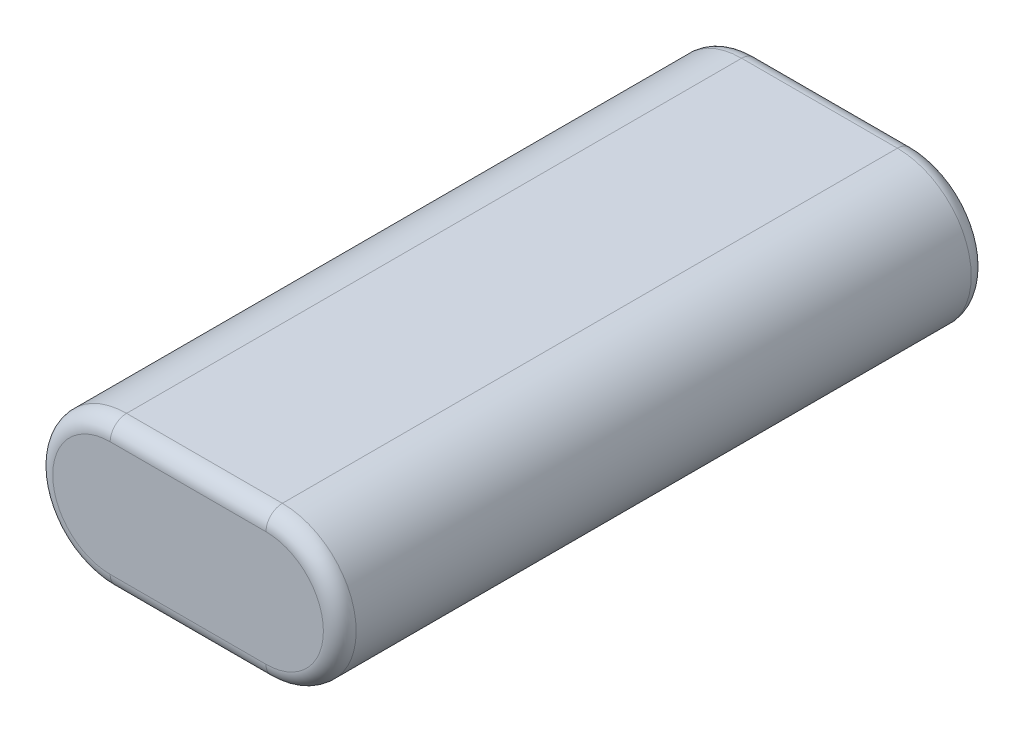
ISO-10303-21;
HEADER;
FILE_DESCRIPTION(('STEP AP214'),'2;1');
FILE_NAME('part.step','',(''),(''),'','','');
FILE_SCHEMA(('AUTOMOTIVE_DESIGN { 1 0 10303 214 1 1 1 1 }'));
ENDSEC;
DATA;
#1=APPLICATION_CONTEXT('core data for automotive mechanical design processes');
#2=APPLICATION_PROTOCOL_DEFINITION('international standard','automotive_design',2000,#1);
#3=PRODUCT_CONTEXT('',#1,'mechanical');
#4=PRODUCT('Part','Part','',(#3));
#5=PRODUCT_RELATED_PRODUCT_CATEGORY('part','',(#4));
#6=PRODUCT_DEFINITION_FORMATION('','',#4);
#7=PRODUCT_DEFINITION_CONTEXT('part definition',#1,'design');
#8=PRODUCT_DEFINITION('design','',#6,#7);
#9=PRODUCT_DEFINITION_SHAPE('','',#8);
#10=(LENGTH_UNIT() NAMED_UNIT(*) SI_UNIT(.MILLI.,.METRE.));
#11=(NAMED_UNIT(*) PLANE_ANGLE_UNIT() SI_UNIT($,.RADIAN.));
#12=(NAMED_UNIT(*) SI_UNIT($,.STERADIAN.) SOLID_ANGLE_UNIT());
#13=UNCERTAINTY_MEASURE_WITH_UNIT(LENGTH_MEASURE(1.E-05),#10,'distance_accuracy_value','');
#14=(GEOMETRIC_REPRESENTATION_CONTEXT(3) GLOBAL_UNCERTAINTY_ASSIGNED_CONTEXT((#13)) GLOBAL_UNIT_ASSIGNED_CONTEXT((#10,
#11,#12)) REPRESENTATION_CONTEXT('',''));
#15=CARTESIAN_POINT('',(0.,0.,0.));
#16=DIRECTION('',(0.,0.,1.));
#17=DIRECTION('',(1.,0.,0.));
#18=AXIS2_PLACEMENT_3D('',#15,#16,#17);
#19=CARTESIAN_POINT('',(0.,-9.,79.));
#20=DIRECTION('',(0.,1.,0.));
#21=DIRECTION('',(0.,0.,1.));
#22=AXIS2_PLACEMENT_3D('',#19,#20,#21);
#23=PLANE('',#22);
#24=DIRECTION('',(0.,0.,-1.));
#25=VECTOR('',#24,1.);
#26=CARTESIAN_POINT('',(0.,-9.,79.));
#27=LINE('',#26,#25);
#28=CARTESIAN_POINT('',(0.,-9.,77.));
#29=VERTEX_POINT('',#28);
#30=CARTESIAN_POINT('',(0.,-9.,2.));
#31=VERTEX_POINT('',#30);
#32=EDGE_CURVE('E123',#29,#31,#27,.T.);
#33=ORIENTED_EDGE('',*,*,#32,.T.);
#34=DIRECTION('',(1.,0.,0.));
#35=VECTOR('',#34,1.);
#36=CARTESIAN_POINT('',(0.,-9.,2.));
#37=LINE('',#36,#35);
#38=CARTESIAN_POINT('',(19.,-9.,2.));
#39=VERTEX_POINT('',#38);
#40=EDGE_CURVE('E125',#31,#39,#37,.T.);
#41=ORIENTED_EDGE('',*,*,#40,.T.);
#42=DIRECTION('',(0.,0.,-1.));
#43=VECTOR('',#42,1.);
#44=CARTESIAN_POINT('',(19.,-9.,79.));
#45=LINE('',#44,#43);
#46=CARTESIAN_POINT('',(19.,-9.,77.));
#47=VERTEX_POINT('',#46);
#48=EDGE_CURVE('E118',#47,#39,#45,.T.);
#49=ORIENTED_EDGE('',*,*,#48,.F.);
#50=DIRECTION('',(1.,0.,0.));
#51=VECTOR('',#50,1.);
#52=CARTESIAN_POINT('',(0.,-9.,77.));
#53=LINE('',#52,#51);
#54=EDGE_CURVE('E104',#47,#29,#53,.F.);
#55=ORIENTED_EDGE('',*,*,#54,.T.);
#56=EDGE_LOOP('',(#33,#41,#49,#55));
#57=FACE_BOUND('',#56,.T.);
#58=ADVANCED_FACE('F35',(#57),#23,.F.);
#59=CARTESIAN_POINT('',(19.,0.,79.));
#60=DIRECTION('',(0.,0.,-1.));
#61=DIRECTION('',(-1.,0.,0.));
#62=AXIS2_PLACEMENT_3D('',#59,#60,#61);
#63=CYLINDRICAL_SURFACE('',#62,9.);
#64=ORIENTED_EDGE('',*,*,#48,.T.);
#65=CARTESIAN_POINT('',(19.,0.,2.));
#66=DIRECTION('',(0.,0.,1.));
#67=DIRECTION('',(1.,0.,0.));
#68=AXIS2_PLACEMENT_3D('',#65,#66,#67);
#69=CIRCLE('',#68,9.);
#70=CARTESIAN_POINT('',(19.,9.,2.));
#71=VERTEX_POINT('',#70);
#72=EDGE_CURVE('E155',#39,#71,#69,.T.);
#73=ORIENTED_EDGE('',*,*,#72,.T.);
#74=DIRECTION('',(0.,0.,-1.));
#75=VECTOR('',#74,1.);
#76=CARTESIAN_POINT('',(19.,9.,79.));
#77=LINE('',#76,#75);
#78=CARTESIAN_POINT('',(19.,9.,77.));
#79=VERTEX_POINT('',#78);
#80=EDGE_CURVE('E134',#79,#71,#77,.T.);
#81=ORIENTED_EDGE('',*,*,#80,.F.);
#82=CARTESIAN_POINT('',(19.,0.,77.));
#83=DIRECTION('',(0.,0.,1.));
#84=DIRECTION('',(1.,0.,0.));
#85=AXIS2_PLACEMENT_3D('',#82,#83,#84);
#86=CIRCLE('',#85,9.);
#87=EDGE_CURVE('E153',#79,#47,#86,.F.);
#88=ORIENTED_EDGE('',*,*,#87,.T.);
#89=EDGE_LOOP('',(#64,#73,#81,#88));
#90=FACE_BOUND('',#89,.T.);
#91=ADVANCED_FACE('F184',(#90),#63,.T.);
#92=CARTESIAN_POINT('',(0.,9.,79.));
#93=DIRECTION('',(0.,1.,0.));
#94=DIRECTION('',(0.,0.,1.));
#95=AXIS2_PLACEMENT_3D('',#92,#93,#94);
#96=PLANE('',#95);
#97=ORIENTED_EDGE('',*,*,#80,.T.);
#98=DIRECTION('',(1.,0.,0.));
#99=VECTOR('',#98,1.);
#100=CARTESIAN_POINT('',(0.,9.,2.));
#101=LINE('',#100,#99);
#102=CARTESIAN_POINT('',(0.,9.,2.));
#103=VERTEX_POINT('',#102);
#104=EDGE_CURVE('E159',#71,#103,#101,.F.);
#105=ORIENTED_EDGE('',*,*,#104,.T.);
#106=DIRECTION('',(0.,0.,-1.));
#107=VECTOR('',#106,1.);
#108=CARTESIAN_POINT('',(0.,9.,79.));
#109=LINE('',#108,#107);
#110=CARTESIAN_POINT('',(0.,9.,77.));
#111=VERTEX_POINT('',#110);
#112=EDGE_CURVE('E131',#111,#103,#109,.T.);
#113=ORIENTED_EDGE('',*,*,#112,.F.);
#114=DIRECTION('',(1.,0.,0.));
#115=VECTOR('',#114,1.);
#116=CARTESIAN_POINT('',(0.,9.,77.));
#117=LINE('',#116,#115);
#118=EDGE_CURVE('E157',#111,#79,#117,.T.);
#119=ORIENTED_EDGE('',*,*,#118,.T.);
#120=EDGE_LOOP('',(#97,#105,#113,#119));
#121=FACE_BOUND('',#120,.T.);
#122=ADVANCED_FACE('F181',(#121),#96,.T.);
#123=CARTESIAN_POINT('',(0.,0.,79.));
#124=DIRECTION('',(0.,0.,-1.));
#125=DIRECTION('',(-1.,0.,0.));
#126=AXIS2_PLACEMENT_3D('',#123,#124,#125);
#127=CYLINDRICAL_SURFACE('',#126,9.);
#128=ORIENTED_EDGE('',*,*,#112,.T.);
#129=CARTESIAN_POINT('',(0.,0.,2.));
#130=DIRECTION('',(0.,0.,1.));
#131=DIRECTION('',(1.,0.,0.));
#132=AXIS2_PLACEMENT_3D('',#129,#130,#131);
#133=CIRCLE('',#132,9.);
#134=EDGE_CURVE('E117',#103,#31,#133,.T.);
#135=ORIENTED_EDGE('',*,*,#134,.T.);
#136=ORIENTED_EDGE('',*,*,#32,.F.);
#137=CARTESIAN_POINT('',(0.,0.,77.));
#138=DIRECTION('',(0.,0.,1.));
#139=DIRECTION('',(1.,0.,0.));
#140=AXIS2_PLACEMENT_3D('',#137,#138,#139);
#141=CIRCLE('',#140,9.);
#142=EDGE_CURVE('E111',#29,#111,#141,.F.);
#143=ORIENTED_EDGE('',*,*,#142,.T.);
#144=EDGE_LOOP('',(#128,#135,#136,#143));
#145=FACE_BOUND('',#144,.T.);
#146=ADVANCED_FACE('F129',(#145),#127,.T.);
#147=CARTESIAN_POINT('',(0.,0.,79.));
#148=DIRECTION('',(0.,0.,1.));
#149=DIRECTION('',(1.,0.,0.));
#150=AXIS2_PLACEMENT_3D('',#147,#148,#149);
#151=PLANE('',#150);
#152=CARTESIAN_POINT('',(0.,0.,79.));
#153=DIRECTION('',(0.,0.,1.));
#154=DIRECTION('',(1.,0.,0.));
#155=AXIS2_PLACEMENT_3D('',#152,#153,#154);
#156=CIRCLE('',#155,7.);
#157=CARTESIAN_POINT('',(0.,7.,79.));
#158=VERTEX_POINT('',#157);
#159=CARTESIAN_POINT('',(0.,-7.,79.));
#160=VERTEX_POINT('',#159);
#161=EDGE_CURVE('E44',#158,#160,#156,.T.);
#162=ORIENTED_EDGE('',*,*,#161,.T.);
#163=DIRECTION('',(1.,0.,0.));
#164=VECTOR('',#163,1.);
#165=CARTESIAN_POINT('',(19.,-7.,79.));
#166=LINE('',#165,#164);
#167=CARTESIAN_POINT('',(19.,-7.,79.));
#168=VERTEX_POINT('',#167);
#169=EDGE_CURVE('E11',#160,#168,#166,.T.);
#170=ORIENTED_EDGE('',*,*,#169,.T.);
#171=CARTESIAN_POINT('',(19.,0.,79.));
#172=DIRECTION('',(0.,0.,1.));
#173=DIRECTION('',(1.,0.,0.));
#174=AXIS2_PLACEMENT_3D('',#171,#172,#173);
#175=CIRCLE('',#174,7.);
#176=CARTESIAN_POINT('',(19.,7.,79.));
#177=VERTEX_POINT('',#176);
#178=EDGE_CURVE('E161',#168,#177,#175,.T.);
#179=ORIENTED_EDGE('',*,*,#178,.T.);
#180=DIRECTION('',(1.,0.,0.));
#181=VECTOR('',#180,1.);
#182=CARTESIAN_POINT('',(0.,7.,79.));
#183=LINE('',#182,#181);
#184=EDGE_CURVE('E55',#177,#158,#183,.F.);
#185=ORIENTED_EDGE('',*,*,#184,.T.);
#186=EDGE_LOOP('',(#162,#170,#179,#185));
#187=FACE_BOUND('',#186,.T.);
#188=ADVANCED_FACE('F277',(#187),#151,.T.);
#189=CARTESIAN_POINT('',(0.,0.,0.));
#190=DIRECTION('',(0.,0.,1.));
#191=DIRECTION('',(1.,0.,0.));
#192=AXIS2_PLACEMENT_3D('',#189,#190,#191);
#193=PLANE('',#192);
#194=DIRECTION('',(1.,0.,0.));
#195=VECTOR('',#194,1.);
#196=CARTESIAN_POINT('',(0.,-7.,0.));
#197=LINE('',#196,#195);
#198=CARTESIAN_POINT('',(19.,-7.,0.));
#199=VERTEX_POINT('',#198);
#200=CARTESIAN_POINT('',(0.,-7.,0.));
#201=VERTEX_POINT('',#200);
#202=EDGE_CURVE('E148',#199,#201,#197,.F.);
#203=ORIENTED_EDGE('',*,*,#202,.T.);
#204=CARTESIAN_POINT('',(0.,0.,0.));
#205=DIRECTION('',(0.,0.,1.));
#206=DIRECTION('',(1.,0.,0.));
#207=AXIS2_PLACEMENT_3D('',#204,#205,#206);
#208=CIRCLE('',#207,7.);
#209=CARTESIAN_POINT('',(0.,7.,0.));
#210=VERTEX_POINT('',#209);
#211=EDGE_CURVE('E126',#201,#210,#208,.F.);
#212=ORIENTED_EDGE('',*,*,#211,.T.);
#213=DIRECTION('',(1.,0.,0.));
#214=VECTOR('',#213,1.);
#215=CARTESIAN_POINT('',(19.,7.,0.));
#216=LINE('',#215,#214);
#217=CARTESIAN_POINT('',(19.,7.,0.));
#218=VERTEX_POINT('',#217);
#219=EDGE_CURVE('E144',#210,#218,#216,.T.);
#220=ORIENTED_EDGE('',*,*,#219,.T.);
#221=CARTESIAN_POINT('',(19.,0.,0.));
#222=DIRECTION('',(0.,0.,1.));
#223=DIRECTION('',(1.,0.,0.));
#224=AXIS2_PLACEMENT_3D('',#221,#222,#223);
#225=CIRCLE('',#224,7.);
#226=EDGE_CURVE('E146',#218,#199,#225,.F.);
#227=ORIENTED_EDGE('',*,*,#226,.T.);
#228=EDGE_LOOP('',(#203,#212,#220,#227));
#229=FACE_BOUND('',#228,.T.);
#230=ADVANCED_FACE('F198',(#229),#193,.F.);
#231=CARTESIAN_POINT('',(19.,0.,2.));
#232=DIRECTION('',(0.,0.,1.));
#233=DIRECTION('',(1.,0.,0.));
#234=AXIS2_PLACEMENT_3D('',#231,#232,#233);
#235=TOROIDAL_SURFACE('',#234,7.,2.);
#236=CARTESIAN_POINT('',(19.,-7.,2.));
#237=DIRECTION('',(-1.,0.,0.));
#238=DIRECTION('',(0.,0.,1.));
#239=AXIS2_PLACEMENT_3D('',#236,#237,#238);
#240=CIRCLE('',#239,2.);
#241=EDGE_CURVE('E137',#199,#39,#240,.T.);
#242=ORIENTED_EDGE('',*,*,#241,.F.);
#243=ORIENTED_EDGE('',*,*,#226,.F.);
#244=CARTESIAN_POINT('',(19.,7.,2.));
#245=DIRECTION('',(-1.,0.,0.));
#246=DIRECTION('',(0.,0.,1.));
#247=AXIS2_PLACEMENT_3D('',#244,#245,#246);
#248=CIRCLE('',#247,2.);
#249=EDGE_CURVE('E132',#71,#218,#248,.T.);
#250=ORIENTED_EDGE('',*,*,#249,.F.);
#251=ORIENTED_EDGE('',*,*,#72,.F.);
#252=EDGE_LOOP('',(#242,#243,#250,#251));
#253=FACE_BOUND('',#252,.T.);
#254=ADVANCED_FACE('F188',(#253),#235,.T.);
#255=CARTESIAN_POINT('',(0.,7.,2.));
#256=DIRECTION('',(-1.,0.,0.));
#257=DIRECTION('',(0.,0.,1.));
#258=AXIS2_PLACEMENT_3D('',#255,#256,#257);
#259=CYLINDRICAL_SURFACE('',#258,2.);
#260=ORIENTED_EDGE('',*,*,#249,.T.);
#261=ORIENTED_EDGE('',*,*,#219,.F.);
#262=CARTESIAN_POINT('',(0.,7.,2.));
#263=DIRECTION('',(-1.,0.,0.));
#264=DIRECTION('',(0.,0.,1.));
#265=AXIS2_PLACEMENT_3D('',#262,#263,#264);
#266=CIRCLE('',#265,2.);
#267=EDGE_CURVE('E167',#103,#210,#266,.T.);
#268=ORIENTED_EDGE('',*,*,#267,.F.);
#269=ORIENTED_EDGE('',*,*,#104,.F.);
#270=EDGE_LOOP('',(#260,#261,#268,#269));
#271=FACE_BOUND('',#270,.T.);
#272=ADVANCED_FACE('F204',(#271),#259,.T.);
#273=CARTESIAN_POINT('',(0.,-7.,2.));
#274=DIRECTION('',(1.,0.,0.));
#275=DIRECTION('',(0.,0.,-1.));
#276=AXIS2_PLACEMENT_3D('',#273,#274,#275);
#277=CYLINDRICAL_SURFACE('',#276,2.);
#278=ORIENTED_EDGE('',*,*,#241,.T.);
#279=ORIENTED_EDGE('',*,*,#40,.F.);
#280=CARTESIAN_POINT('',(0.,-7.,2.));
#281=DIRECTION('',(-1.,0.,0.));
#282=DIRECTION('',(0.,0.,1.));
#283=AXIS2_PLACEMENT_3D('',#280,#281,#282);
#284=CIRCLE('',#283,2.);
#285=EDGE_CURVE('E165',#201,#31,#284,.T.);
#286=ORIENTED_EDGE('',*,*,#285,.F.);
#287=ORIENTED_EDGE('',*,*,#202,.F.);
#288=EDGE_LOOP('',(#278,#279,#286,#287));
#289=FACE_BOUND('',#288,.T.);
#290=ADVANCED_FACE('F194',(#289),#277,.T.);
#291=CARTESIAN_POINT('',(0.,0.,2.));
#292=DIRECTION('',(0.,0.,1.));
#293=DIRECTION('',(1.,0.,0.));
#294=AXIS2_PLACEMENT_3D('',#291,#292,#293);
#295=TOROIDAL_SURFACE('',#294,7.,2.);
#296=ORIENTED_EDGE('',*,*,#267,.T.);
#297=ORIENTED_EDGE('',*,*,#211,.F.);
#298=ORIENTED_EDGE('',*,*,#285,.T.);
#299=ORIENTED_EDGE('',*,*,#134,.F.);
#300=EDGE_LOOP('',(#296,#297,#298,#299));
#301=FACE_BOUND('',#300,.T.);
#302=ADVANCED_FACE('F200',(#301),#295,.T.);
#303=CARTESIAN_POINT('',(0.,7.,77.));
#304=DIRECTION('',(1.,0.,0.));
#305=DIRECTION('',(0.,0.,-1.));
#306=AXIS2_PLACEMENT_3D('',#303,#304,#305);
#307=CYLINDRICAL_SURFACE('',#306,2.);
#308=CARTESIAN_POINT('',(19.,7.,77.));
#309=DIRECTION('',(1.,0.,0.));
#310=DIRECTION('',(0.,0.,-1.));
#311=AXIS2_PLACEMENT_3D('',#308,#309,#310);
#312=CIRCLE('',#311,2.);
#313=EDGE_CURVE('E107',#79,#177,#312,.T.);
#314=ORIENTED_EDGE('',*,*,#313,.F.);
#315=ORIENTED_EDGE('',*,*,#118,.F.);
#316=CARTESIAN_POINT('',(0.,7.,77.));
#317=DIRECTION('',(-1.,0.,0.));
#318=DIRECTION('',(0.,0.,1.));
#319=AXIS2_PLACEMENT_3D('',#316,#317,#318);
#320=CIRCLE('',#319,2.);
#321=EDGE_CURVE('E39',#158,#111,#320,.T.);
#322=ORIENTED_EDGE('',*,*,#321,.F.);
#323=ORIENTED_EDGE('',*,*,#184,.F.);
#324=EDGE_LOOP('',(#314,#315,#322,#323));
#325=FACE_BOUND('',#324,.T.);
#326=ADVANCED_FACE('F37',(#325),#307,.T.);
#327=CARTESIAN_POINT('',(0.,0.,77.));
#328=DIRECTION('',(0.,0.,1.));
#329=DIRECTION('',(1.,0.,0.));
#330=AXIS2_PLACEMENT_3D('',#327,#328,#329);
#331=TOROIDAL_SURFACE('',#330,7.,2.);
#332=ORIENTED_EDGE('',*,*,#321,.T.);
#333=ORIENTED_EDGE('',*,*,#142,.F.);
#334=CARTESIAN_POINT('',(0.,-7.,77.));
#335=DIRECTION('',(1.,0.,0.));
#336=DIRECTION('',(0.,0.,-1.));
#337=AXIS2_PLACEMENT_3D('',#334,#335,#336);
#338=CIRCLE('',#337,2.);
#339=EDGE_CURVE('E100',#160,#29,#338,.T.);
#340=ORIENTED_EDGE('',*,*,#339,.F.);
#341=ORIENTED_EDGE('',*,*,#161,.F.);
#342=EDGE_LOOP('',(#332,#333,#340,#341));
#343=FACE_BOUND('',#342,.T.);
#344=ADVANCED_FACE('F112',(#343),#331,.T.);
#345=CARTESIAN_POINT('',(19.,0.,77.));
#346=DIRECTION('',(0.,0.,1.));
#347=DIRECTION('',(1.,0.,0.));
#348=AXIS2_PLACEMENT_3D('',#345,#346,#347);
#349=TOROIDAL_SURFACE('',#348,7.,2.);
#350=ORIENTED_EDGE('',*,*,#313,.T.);
#351=ORIENTED_EDGE('',*,*,#178,.F.);
#352=CARTESIAN_POINT('',(19.,-7.,77.));
#353=DIRECTION('',(-1.,0.,0.));
#354=DIRECTION('',(0.,0.,1.));
#355=AXIS2_PLACEMENT_3D('',#352,#353,#354);
#356=CIRCLE('',#355,2.);
#357=EDGE_CURVE('E108',#47,#168,#356,.T.);
#358=ORIENTED_EDGE('',*,*,#357,.F.);
#359=ORIENTED_EDGE('',*,*,#87,.F.);
#360=EDGE_LOOP('',(#350,#351,#358,#359));
#361=FACE_BOUND('',#360,.T.);
#362=ADVANCED_FACE('F176',(#361),#349,.T.);
#363=CARTESIAN_POINT('',(0.,-7.,77.));
#364=DIRECTION('',(-1.,0.,0.));
#365=DIRECTION('',(0.,0.,1.));
#366=AXIS2_PLACEMENT_3D('',#363,#364,#365);
#367=CYLINDRICAL_SURFACE('',#366,2.);
#368=ORIENTED_EDGE('',*,*,#339,.T.);
#369=ORIENTED_EDGE('',*,*,#54,.F.);
#370=ORIENTED_EDGE('',*,*,#357,.T.);
#371=ORIENTED_EDGE('',*,*,#169,.F.);
#372=EDGE_LOOP('',(#368,#369,#370,#371));
#373=FACE_BOUND('',#372,.T.);
#374=ADVANCED_FACE('F102',(#373),#367,.T.);
#375=CLOSED_SHELL('',(#58,#91,#122,#146,#188,#230,#254,#272,#290,#302,#326,#344,#362,#374));
#376=MANIFOLD_SOLID_BREP('B2',#375);
#377=ADVANCED_BREP_SHAPE_REPRESENTATION('',(#18,#376),#14);
#378=SHAPE_DEFINITION_REPRESENTATION(#9,#377);
ENDSEC;
END-ISO-10303-21;
